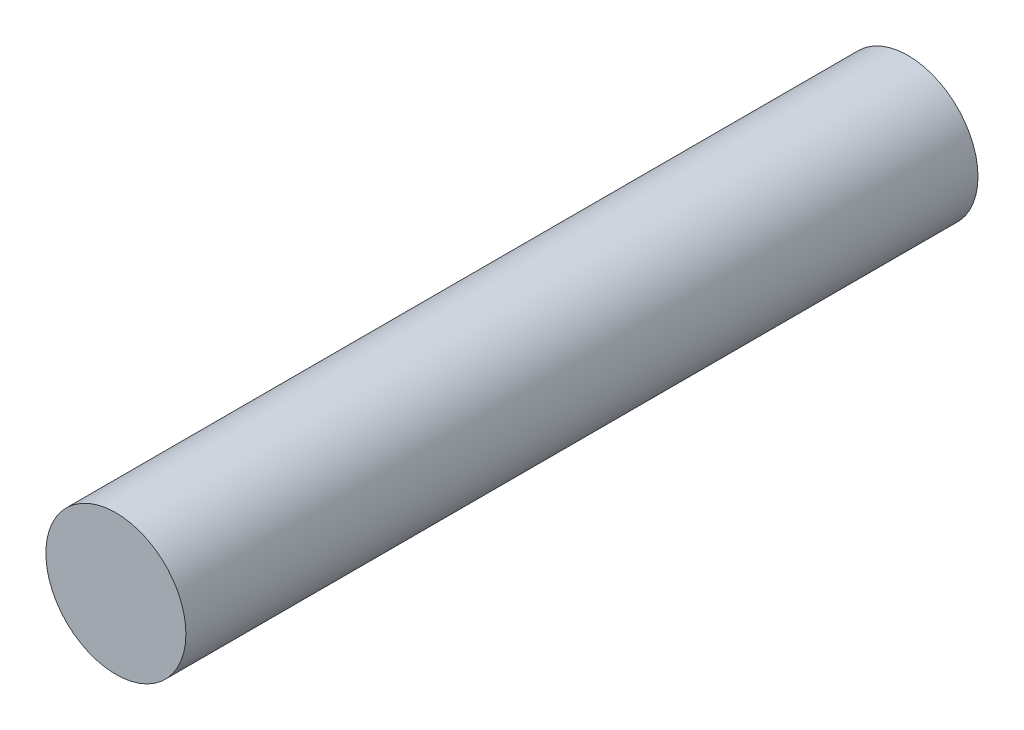
ISO-10303-21;
HEADER;
FILE_DESCRIPTION(('STEP AP214'),'2;1');
FILE_NAME('part.step','',(''),(''),'','','');
FILE_SCHEMA(('AUTOMOTIVE_DESIGN { 1 0 10303 214 1 1 1 1 }'));
ENDSEC;
DATA;
#1=APPLICATION_CONTEXT('core data for automotive mechanical design processes');
#2=APPLICATION_PROTOCOL_DEFINITION('international standard','automotive_design',2000,#1);
#3=PRODUCT_CONTEXT('',#1,'mechanical');
#4=PRODUCT('Part','Part','',(#3));
#5=PRODUCT_RELATED_PRODUCT_CATEGORY('part','',(#4));
#6=PRODUCT_DEFINITION_FORMATION('','',#4);
#7=PRODUCT_DEFINITION_CONTEXT('part definition',#1,'design');
#8=PRODUCT_DEFINITION('design','',#6,#7);
#9=PRODUCT_DEFINITION_SHAPE('','',#8);
#10=(LENGTH_UNIT() NAMED_UNIT(*) SI_UNIT(.MILLI.,.METRE.));
#11=(NAMED_UNIT(*) PLANE_ANGLE_UNIT() SI_UNIT($,.RADIAN.));
#12=(NAMED_UNIT(*) SI_UNIT($,.STERADIAN.) SOLID_ANGLE_UNIT());
#13=UNCERTAINTY_MEASURE_WITH_UNIT(LENGTH_MEASURE(1.E-05),#10,'distance_accuracy_value','');
#14=(GEOMETRIC_REPRESENTATION_CONTEXT(3) GLOBAL_UNCERTAINTY_ASSIGNED_CONTEXT((#13)) GLOBAL_UNIT_ASSIGNED_CONTEXT((#10,
#11,#12)) REPRESENTATION_CONTEXT('',''));
#15=CARTESIAN_POINT('',(0.,0.,0.));
#16=DIRECTION('',(0.,0.,1.));
#17=DIRECTION('',(1.,0.,0.));
#18=AXIS2_PLACEMENT_3D('',#15,#16,#17);
#19=CARTESIAN_POINT('',(0.,0.,33.93948));
#20=DIRECTION('',(0.,0.,-1.));
#21=DIRECTION('',(-1.,0.,0.));
#22=AXIS2_PLACEMENT_3D('',#19,#20,#21);
#23=CYLINDRICAL_SURFACE('',#22,3.);
#24=CARTESIAN_POINT('',(0.,0.,33.93948));
#25=DIRECTION('',(0.,0.,1.));
#26=DIRECTION('',(1.,0.,0.));
#27=AXIS2_PLACEMENT_3D('',#24,#25,#26);
#28=CIRCLE('',#27,3.);
#29=CARTESIAN_POINT('',(3.,0.,33.93948));
#30=VERTEX_POINT('',#29);
#31=EDGE_CURVE('E10',#30,#30,#28,.T.);
#32=ORIENTED_EDGE('',*,*,#31,.F.);
#33=EDGE_LOOP('',(#32));
#34=FACE_BOUND('',#33,.T.);
#35=CARTESIAN_POINT('',(0.,0.,0.));
#36=DIRECTION('',(0.,0.,1.));
#37=DIRECTION('',(1.,0.,0.));
#38=AXIS2_PLACEMENT_3D('',#35,#36,#37);
#39=CIRCLE('',#38,3.);
#40=CARTESIAN_POINT('',(3.,0.,0.));
#41=VERTEX_POINT('',#40);
#42=EDGE_CURVE('E46',#41,#41,#39,.T.);
#43=ORIENTED_EDGE('',*,*,#42,.T.);
#44=EDGE_LOOP('',(#43));
#45=FACE_BOUND('',#44,.T.);
#46=ADVANCED_FACE('F43',(#34,#45),#23,.T.);
#47=CARTESIAN_POINT('',(0.,0.,33.93948));
#48=DIRECTION('',(0.,0.,1.));
#49=DIRECTION('',(1.,0.,0.));
#50=AXIS2_PLACEMENT_3D('',#47,#48,#49);
#51=PLANE('',#50);
#52=ORIENTED_EDGE('',*,*,#31,.T.);
#53=EDGE_LOOP('',(#52));
#54=FACE_BOUND('',#53,.T.);
#55=ADVANCED_FACE('F58',(#54),#51,.T.);
#56=CARTESIAN_POINT('',(0.,0.,0.));
#57=DIRECTION('',(0.,0.,1.));
#58=DIRECTION('',(1.,0.,0.));
#59=AXIS2_PLACEMENT_3D('',#56,#57,#58);
#60=PLANE('',#59);
#61=ORIENTED_EDGE('',*,*,#42,.F.);
#62=EDGE_LOOP('',(#61));
#63=FACE_BOUND('',#62,.T.);
#64=ADVANCED_FACE('F59',(#63),#60,.F.);
#65=CLOSED_SHELL('',(#46,#55,#64));
#66=MANIFOLD_SOLID_BREP('B2',#65);
#67=ADVANCED_BREP_SHAPE_REPRESENTATION('',(#18,#66),#14);
#68=SHAPE_DEFINITION_REPRESENTATION(#9,#67);
ENDSEC;
END-ISO-10303-21;
